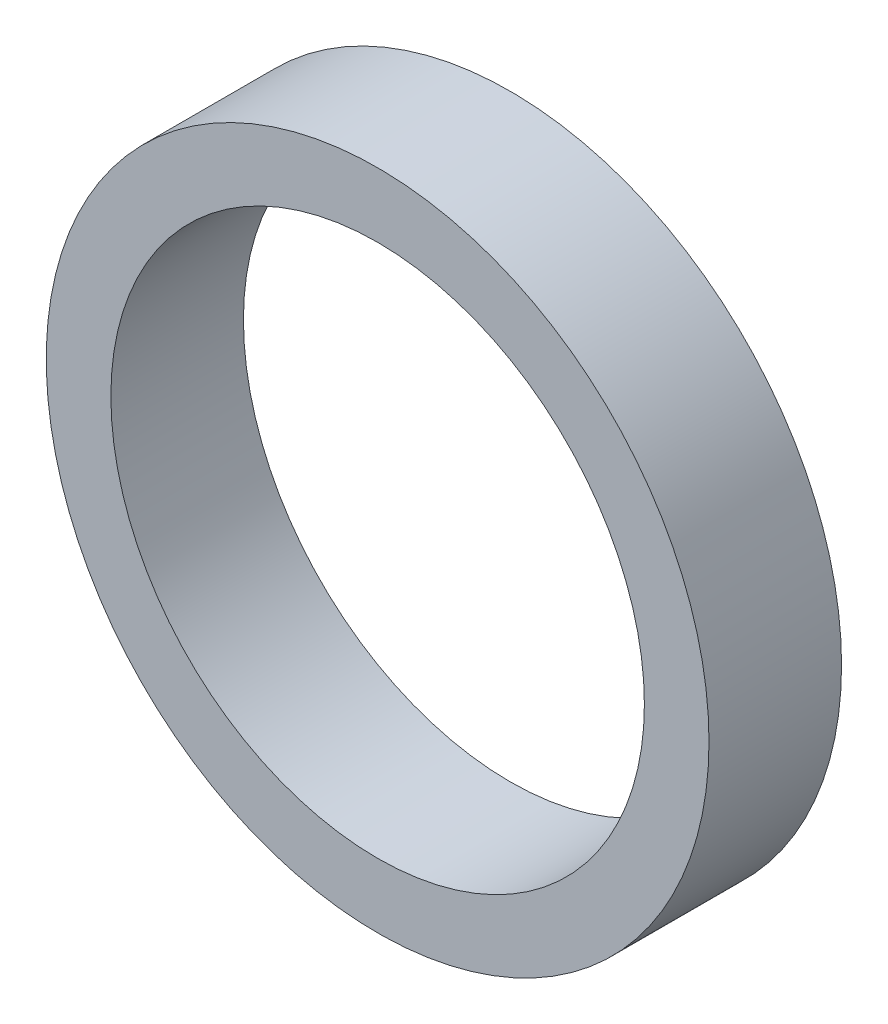
ISO-10303-21;
HEADER;
FILE_DESCRIPTION(('STEP AP214'),'2;1');
FILE_NAME('part.step','',(''),(''),'','','');
FILE_SCHEMA(('AUTOMOTIVE_DESIGN { 1 0 10303 214 1 1 1 1 }'));
ENDSEC;
DATA;
#1=APPLICATION_CONTEXT('core data for automotive mechanical design processes');
#2=APPLICATION_PROTOCOL_DEFINITION('international standard','automotive_design',2000,#1);
#3=PRODUCT_CONTEXT('',#1,'mechanical');
#4=PRODUCT('Part','Part','',(#3));
#5=PRODUCT_RELATED_PRODUCT_CATEGORY('part','',(#4));
#6=PRODUCT_DEFINITION_FORMATION('','',#4);
#7=PRODUCT_DEFINITION_CONTEXT('part definition',#1,'design');
#8=PRODUCT_DEFINITION('design','',#6,#7);
#9=PRODUCT_DEFINITION_SHAPE('','',#8);
#10=(LENGTH_UNIT() NAMED_UNIT(*) SI_UNIT(.MILLI.,.METRE.));
#11=(NAMED_UNIT(*) PLANE_ANGLE_UNIT() SI_UNIT($,.RADIAN.));
#12=(NAMED_UNIT(*) SI_UNIT($,.STERADIAN.) SOLID_ANGLE_UNIT());
#13=UNCERTAINTY_MEASURE_WITH_UNIT(LENGTH_MEASURE(1.E-05),#10,'distance_accuracy_value','');
#14=(GEOMETRIC_REPRESENTATION_CONTEXT(3) GLOBAL_UNCERTAINTY_ASSIGNED_CONTEXT((#13)) GLOBAL_UNIT_ASSIGNED_CONTEXT((#10,
#11,#12)) REPRESENTATION_CONTEXT('',''));
#15=CARTESIAN_POINT('',(0.,0.,0.));
#16=DIRECTION('',(0.,0.,1.));
#17=DIRECTION('',(1.,0.,0.));
#18=AXIS2_PLACEMENT_3D('',#15,#16,#17);
#19=CARTESIAN_POINT('',(0.,0.,2.));
#20=DIRECTION('',(0.,0.,1.));
#21=DIRECTION('',(1.,0.,0.));
#22=AXIS2_PLACEMENT_3D('',#19,#20,#21);
#23=PLANE('',#22);
#24=CARTESIAN_POINT('',(0.,0.,2.));
#25=DIRECTION('',(0.,0.,1.));
#26=DIRECTION('',(1.,0.,0.));
#27=AXIS2_PLACEMENT_3D('',#24,#25,#26);
#28=CIRCLE('',#27,5.);
#29=CARTESIAN_POINT('',(5.,0.,2.));
#30=VERTEX_POINT('',#29);
#31=EDGE_CURVE('E10',#30,#30,#28,.T.);
#32=ORIENTED_EDGE('',*,*,#31,.T.);
#33=EDGE_LOOP('',(#32));
#34=FACE_BOUND('',#33,.T.);
#35=CARTESIAN_POINT('',(0.,0.,2.));
#36=DIRECTION('',(0.,0.,1.));
#37=DIRECTION('',(1.,0.,0.));
#38=AXIS2_PLACEMENT_3D('',#35,#36,#37);
#39=CIRCLE('',#38,4.025);
#40=CARTESIAN_POINT('',(4.025,0.,2.));
#41=VERTEX_POINT('',#40);
#42=EDGE_CURVE('E41',#41,#41,#39,.T.);
#43=ORIENTED_EDGE('',*,*,#42,.F.);
#44=EDGE_LOOP('',(#43));
#45=FACE_BOUND('',#44,.T.);
#46=ADVANCED_FACE('F30',(#34,#45),#23,.T.);
#47=CARTESIAN_POINT('',(0.,0.,0.));
#48=DIRECTION('',(0.,0.,1.));
#49=DIRECTION('',(1.,0.,0.));
#50=AXIS2_PLACEMENT_3D('',#47,#48,#49);
#51=PLANE('',#50);
#52=CARTESIAN_POINT('',(0.,0.,0.));
#53=DIRECTION('',(0.,0.,1.));
#54=DIRECTION('',(1.,0.,0.));
#55=AXIS2_PLACEMENT_3D('',#52,#53,#54);
#56=CIRCLE('',#55,5.);
#57=CARTESIAN_POINT('',(5.,0.,0.));
#58=VERTEX_POINT('',#57);
#59=EDGE_CURVE('E34',#58,#58,#56,.T.);
#60=ORIENTED_EDGE('',*,*,#59,.F.);
#61=EDGE_LOOP('',(#60));
#62=FACE_BOUND('',#61,.T.);
#63=CARTESIAN_POINT('',(0.,0.,0.));
#64=DIRECTION('',(0.,0.,1.));
#65=DIRECTION('',(1.,0.,0.));
#66=AXIS2_PLACEMENT_3D('',#63,#64,#65);
#67=CIRCLE('',#66,4.025);
#68=CARTESIAN_POINT('',(4.025,0.,0.));
#69=VERTEX_POINT('',#68);
#70=EDGE_CURVE('E43',#69,#69,#67,.T.);
#71=ORIENTED_EDGE('',*,*,#70,.T.);
#72=EDGE_LOOP('',(#71));
#73=FACE_BOUND('',#72,.T.);
#74=ADVANCED_FACE('F53',(#62,#73),#51,.F.);
#75=CARTESIAN_POINT('',(0.,0.,2.));
#76=DIRECTION('',(0.,0.,-1.));
#77=DIRECTION('',(-1.,0.,0.));
#78=AXIS2_PLACEMENT_3D('',#75,#76,#77);
#79=CYLINDRICAL_SURFACE('',#78,5.);
#80=ORIENTED_EDGE('',*,*,#31,.F.);
#81=EDGE_LOOP('',(#80));
#82=FACE_BOUND('',#81,.T.);
#83=ORIENTED_EDGE('',*,*,#59,.T.);
#84=EDGE_LOOP('',(#83));
#85=FACE_BOUND('',#84,.T.);
#86=ADVANCED_FACE('F32',(#82,#85),#79,.T.);
#87=CARTESIAN_POINT('',(0.,0.,2.));
#88=DIRECTION('',(0.,0.,-1.));
#89=DIRECTION('',(-1.,0.,0.));
#90=AXIS2_PLACEMENT_3D('',#87,#88,#89);
#91=CYLINDRICAL_SURFACE('',#90,4.025);
#92=ORIENTED_EDGE('',*,*,#42,.T.);
#93=EDGE_LOOP('',(#92));
#94=FACE_BOUND('',#93,.T.);
#95=ORIENTED_EDGE('',*,*,#70,.F.);
#96=EDGE_LOOP('',(#95));
#97=FACE_BOUND('',#96,.T.);
#98=ADVANCED_FACE('F49',(#94,#97),#91,.F.);
#99=CLOSED_SHELL('',(#46,#74,#86,#98));
#100=MANIFOLD_SOLID_BREP('B2',#99);
#101=ADVANCED_BREP_SHAPE_REPRESENTATION('',(#18,#100),#14);
#102=SHAPE_DEFINITION_REPRESENTATION(#9,#101);
ENDSEC;
END-ISO-10303-21;
